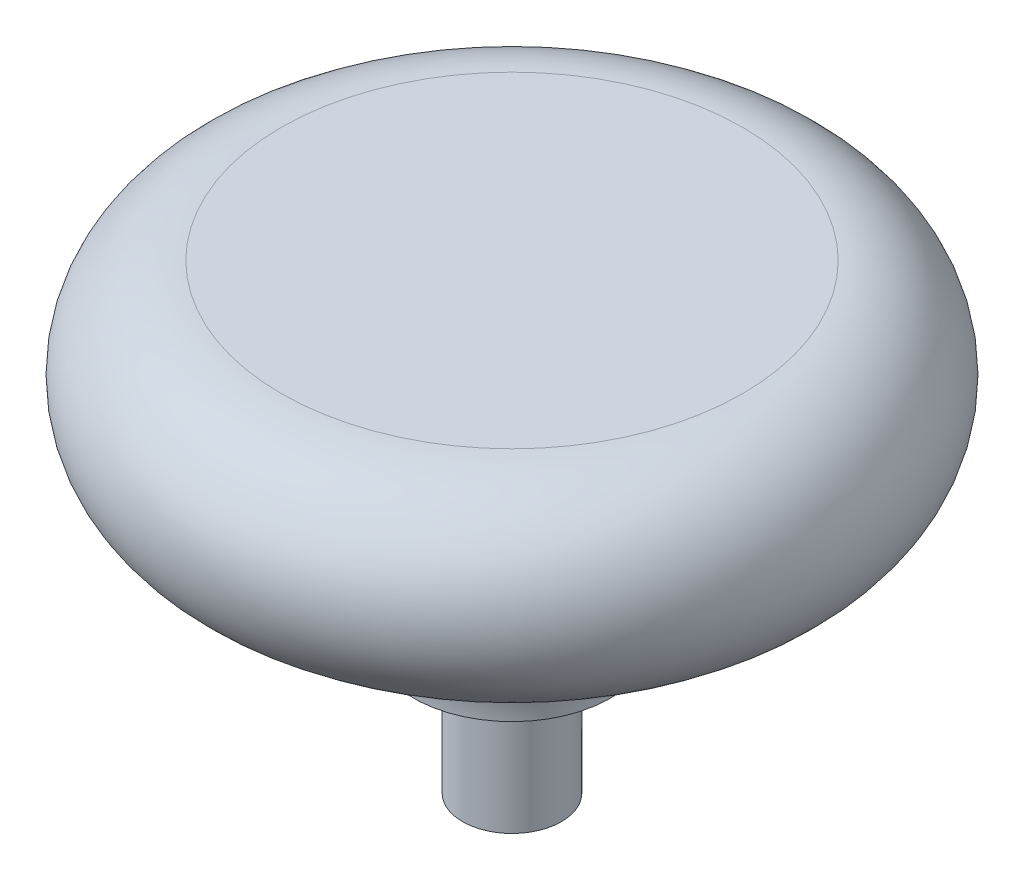
ISO-10303-21;
HEADER;
FILE_DESCRIPTION(('STEP AP214'),'2;1');
FILE_NAME('part.step','',(''),(''),'','','');
FILE_SCHEMA(('AUTOMOTIVE_DESIGN { 1 0 10303 214 1 1 1 1 }'));
ENDSEC;
DATA;
#1=APPLICATION_CONTEXT('core data for automotive mechanical design processes');
#2=APPLICATION_PROTOCOL_DEFINITION('international standard','automotive_design',2000,#1);
#3=PRODUCT_CONTEXT('',#1,'mechanical');
#4=PRODUCT('Part','Part','',(#3));
#5=PRODUCT_RELATED_PRODUCT_CATEGORY('part','',(#4));
#6=PRODUCT_DEFINITION_FORMATION('','',#4);
#7=PRODUCT_DEFINITION_CONTEXT('part definition',#1,'design');
#8=PRODUCT_DEFINITION('design','',#6,#7);
#9=PRODUCT_DEFINITION_SHAPE('','',#8);
#10=(LENGTH_UNIT() NAMED_UNIT(*) SI_UNIT(.MILLI.,.METRE.));
#11=(NAMED_UNIT(*) PLANE_ANGLE_UNIT() SI_UNIT($,.RADIAN.));
#12=(NAMED_UNIT(*) SI_UNIT($,.STERADIAN.) SOLID_ANGLE_UNIT());
#13=UNCERTAINTY_MEASURE_WITH_UNIT(LENGTH_MEASURE(1.E-05),#10,'distance_accuracy_value','');
#14=(GEOMETRIC_REPRESENTATION_CONTEXT(3) GLOBAL_UNCERTAINTY_ASSIGNED_CONTEXT((#13)) GLOBAL_UNIT_ASSIGNED_CONTEXT((#10,
#11,#12)) REPRESENTATION_CONTEXT('',''));
#15=CARTESIAN_POINT('',(0.,0.,0.));
#16=DIRECTION('',(0.,0.,1.));
#17=DIRECTION('',(1.,0.,0.));
#18=AXIS2_PLACEMENT_3D('',#15,#16,#17);
#19=CARTESIAN_POINT('',(2.38125,0.,0.));
#20=DIRECTION('',(0.,1.,0.));
#21=DIRECTION('',(0.,0.,1.));
#22=AXIS2_PLACEMENT_3D('',#19,#20,#21);
#23=PLANE('',#22);
#24=CARTESIAN_POINT('',(0.,0.,0.));
#25=DIRECTION('',(0.,-1.,0.));
#26=DIRECTION('',(0.,0.,-1.));
#27=AXIS2_PLACEMENT_3D('',#24,#25,#26);
#28=CIRCLE('',#27,2.38125);
#29=CARTESIAN_POINT('',(0.,0.,-2.38125));
#30=VERTEX_POINT('',#29);
#31=EDGE_CURVE('E54',#30,#30,#28,.T.);
#32=ORIENTED_EDGE('',*,*,#31,.T.);
#33=EDGE_LOOP('',(#32));
#34=FACE_BOUND('',#33,.T.);
#35=ADVANCED_FACE('F35',(#34),#23,.F.);
#36=CARTESIAN_POINT('',(0.,22.225,0.));
#37=DIRECTION('',(0.,-1.,0.));
#38=DIRECTION('',(0.,0.,-1.));
#39=AXIS2_PLACEMENT_3D('',#36,#37,#38);
#40=PLANE('',#39);
#41=CARTESIAN_POINT('',(0.,22.225,0.));
#42=DIRECTION('',(0.,-1.,0.));
#43=DIRECTION('',(0.,0.,-1.));
#44=AXIS2_PLACEMENT_3D('',#41,#42,#43);
#45=CIRCLE('',#44,11.1125);
#46=CARTESIAN_POINT('',(0.,22.225,-11.1125));
#47=VERTEX_POINT('',#46);
#48=EDGE_CURVE('E10',#47,#47,#45,.T.);
#49=ORIENTED_EDGE('',*,*,#48,.F.);
#50=EDGE_LOOP('',(#49));
#51=FACE_BOUND('',#50,.T.);
#52=ADVANCED_FACE('F78',(#51),#40,.F.);
#53=CARTESIAN_POINT('',(0.,17.4625,0.));
#54=DIRECTION('',(0.,-1.,0.));
#55=DIRECTION('',(0.,0.,-1.));
#56=AXIS2_PLACEMENT_3D('',#53,#54,#55);
#57=TOROIDAL_SURFACE('',#56,11.1125,4.7625);
#58=CARTESIAN_POINT('',(0.,12.7,0.));
#59=DIRECTION('',(0.,-1.,0.));
#60=DIRECTION('',(0.,0.,-1.));
#61=AXIS2_PLACEMENT_3D('',#58,#59,#60);
#62=CIRCLE('',#61,11.1125);
#63=CARTESIAN_POINT('',(0.,12.7,-11.1125));
#64=VERTEX_POINT('',#63);
#65=EDGE_CURVE('E41',#64,#64,#62,.T.);
#66=ORIENTED_EDGE('',*,*,#65,.F.);
#67=EDGE_LOOP('',(#66));
#68=FACE_BOUND('',#67,.T.);
#69=ORIENTED_EDGE('',*,*,#48,.T.);
#70=EDGE_LOOP('',(#69));
#71=FACE_BOUND('',#70,.T.);
#72=ADVANCED_FACE('F73',(#68,#71),#57,.T.);
#73=CARTESIAN_POINT('',(0.,6.35,0.));
#74=DIRECTION('',(0.,-1.,0.));
#75=DIRECTION('',(0.,0.,-1.));
#76=AXIS2_PLACEMENT_3D('',#73,#74,#75);
#77=TOROIDAL_SURFACE('',#76,11.1125,6.35);
#78=CARTESIAN_POINT('',(0.,6.35,0.));
#79=DIRECTION('',(0.,-1.,0.));
#80=DIRECTION('',(0.,0.,-1.));
#81=AXIS2_PLACEMENT_3D('',#78,#79,#80);
#82=CIRCLE('',#81,4.7625);
#83=CARTESIAN_POINT('',(0.,6.35,-4.7625));
#84=VERTEX_POINT('',#83);
#85=EDGE_CURVE('E45',#84,#84,#82,.T.);
#86=ORIENTED_EDGE('',*,*,#85,.F.);
#87=EDGE_LOOP('',(#86));
#88=FACE_BOUND('',#87,.T.);
#89=ORIENTED_EDGE('',*,*,#65,.T.);
#90=EDGE_LOOP('',(#89));
#91=FACE_BOUND('',#90,.T.);
#92=ADVANCED_FACE('F68',(#88,#91),#77,.F.);
#93=CARTESIAN_POINT('',(4.7625,6.35,0.));
#94=DIRECTION('',(0.,1.,0.));
#95=DIRECTION('',(0.,0.,1.));
#96=AXIS2_PLACEMENT_3D('',#93,#94,#95);
#97=PLANE('',#96);
#98=CARTESIAN_POINT('',(0.,6.35,0.));
#99=DIRECTION('',(0.,-1.,0.));
#100=DIRECTION('',(0.,0.,-1.));
#101=AXIS2_PLACEMENT_3D('',#98,#99,#100);
#102=CIRCLE('',#101,2.38125);
#103=CARTESIAN_POINT('',(0.,6.35,-2.38125));
#104=VERTEX_POINT('',#103);
#105=EDGE_CURVE('E49',#104,#104,#102,.T.);
#106=ORIENTED_EDGE('',*,*,#105,.F.);
#107=EDGE_LOOP('',(#106));
#108=FACE_BOUND('',#107,.T.);
#109=ORIENTED_EDGE('',*,*,#85,.T.);
#110=EDGE_LOOP('',(#109));
#111=FACE_BOUND('',#110,.T.);
#112=ADVANCED_FACE('F62',(#108,#111),#97,.F.);
#113=CARTESIAN_POINT('',(0.,0.,0.));
#114=DIRECTION('',(0.,-1.,0.));
#115=DIRECTION('',(0.,0.,-1.));
#116=AXIS2_PLACEMENT_3D('',#113,#114,#115);
#117=CYLINDRICAL_SURFACE('',#116,2.38125);
#118=ORIENTED_EDGE('',*,*,#31,.F.);
#119=EDGE_LOOP('',(#118));
#120=FACE_BOUND('',#119,.T.);
#121=ORIENTED_EDGE('',*,*,#105,.T.);
#122=EDGE_LOOP('',(#121));
#123=FACE_BOUND('',#122,.T.);
#124=ADVANCED_FACE('F59',(#120,#123),#117,.T.);
#125=CLOSED_SHELL('',(#35,#52,#72,#92,#112,#124));
#126=MANIFOLD_SOLID_BREP('B2',#125);
#127=ADVANCED_BREP_SHAPE_REPRESENTATION('',(#18,#126),#14);
#128=SHAPE_DEFINITION_REPRESENTATION(#9,#127);
ENDSEC;
END-ISO-10303-21;
